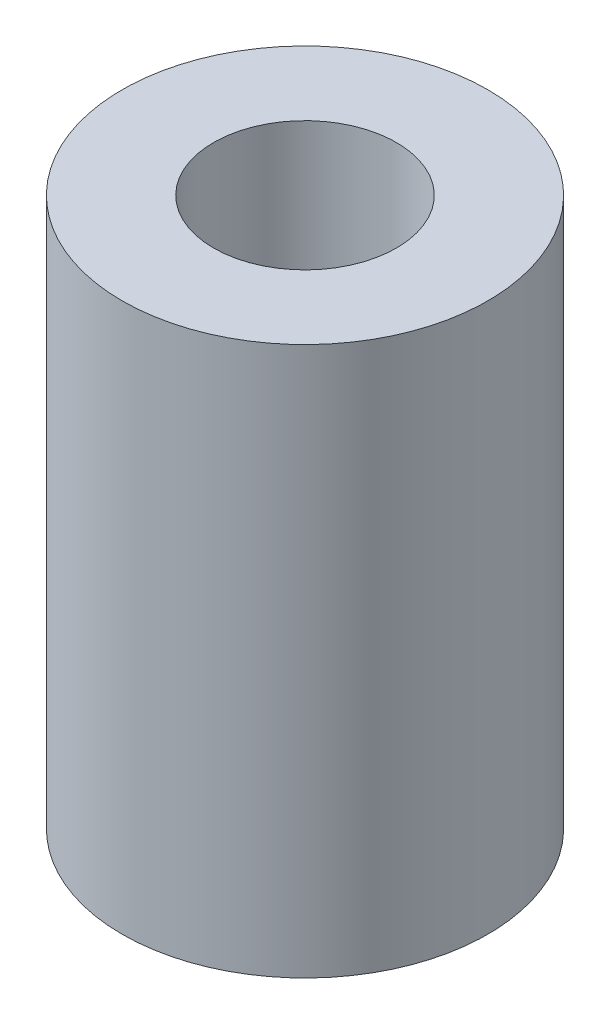
ISO-10303-21;
HEADER;
FILE_DESCRIPTION(('STEP AP214'),'2;1');
FILE_NAME('part.step','',(''),(''),'','','');
FILE_SCHEMA(('AUTOMOTIVE_DESIGN { 1 0 10303 214 1 1 1 1 }'));
ENDSEC;
DATA;
#1=APPLICATION_CONTEXT('core data for automotive mechanical design processes');
#2=APPLICATION_PROTOCOL_DEFINITION('international standard','automotive_design',2000,#1);
#3=PRODUCT_CONTEXT('',#1,'mechanical');
#4=PRODUCT('Part','Part','',(#3));
#5=PRODUCT_RELATED_PRODUCT_CATEGORY('part','',(#4));
#6=PRODUCT_DEFINITION_FORMATION('','',#4);
#7=PRODUCT_DEFINITION_CONTEXT('part definition',#1,'design');
#8=PRODUCT_DEFINITION('design','',#6,#7);
#9=PRODUCT_DEFINITION_SHAPE('','',#8);
#10=(LENGTH_UNIT() NAMED_UNIT(*) SI_UNIT(.MILLI.,.METRE.));
#11=(NAMED_UNIT(*) PLANE_ANGLE_UNIT() SI_UNIT($,.RADIAN.));
#12=(NAMED_UNIT(*) SI_UNIT($,.STERADIAN.) SOLID_ANGLE_UNIT());
#13=UNCERTAINTY_MEASURE_WITH_UNIT(LENGTH_MEASURE(1.E-05),#10,'distance_accuracy_value','');
#14=(GEOMETRIC_REPRESENTATION_CONTEXT(3) GLOBAL_UNCERTAINTY_ASSIGNED_CONTEXT((#13)) GLOBAL_UNIT_ASSIGNED_CONTEXT((#10,
#11,#12)) REPRESENTATION_CONTEXT('',''));
#15=CARTESIAN_POINT('',(0.,0.,0.));
#16=DIRECTION('',(0.,0.,1.));
#17=DIRECTION('',(1.,0.,0.));
#18=AXIS2_PLACEMENT_3D('',#15,#16,#17);
#19=CARTESIAN_POINT('',(0.,19.05,0.));
#20=DIRECTION('',(0.,-1.,0.));
#21=DIRECTION('',(0.,0.,-1.));
#22=AXIS2_PLACEMENT_3D('',#19,#20,#21);
#23=CYLINDRICAL_SURFACE('',#22,6.35);
#24=CARTESIAN_POINT('',(0.,19.05,0.));
#25=DIRECTION('',(0.,1.,0.));
#26=DIRECTION('',(0.,0.,1.));
#27=AXIS2_PLACEMENT_3D('',#24,#25,#26);
#28=CIRCLE('',#27,6.35);
#29=CARTESIAN_POINT('',(0.,19.05,-6.35));
#30=VERTEX_POINT('',#29);
#31=EDGE_CURVE('E10',#30,#30,#28,.T.);
#32=CARTESIAN_POINT('',(0.,0.,0.));
#33=DIRECTION('',(0.,1.,0.));
#34=DIRECTION('',(0.,0.,1.));
#35=AXIS2_PLACEMENT_3D('',#32,#33,#34);
#36=CIRCLE('',#35,6.35);
#37=CARTESIAN_POINT('',(0.,0.,-6.35));
#38=VERTEX_POINT('',#37);
#39=EDGE_CURVE('E35',#38,#38,#36,.T.);
#40=CARTESIAN_POINT('',(0.,19.05,-6.35));
#41=CARTESIAN_POINT('',(0.,18.8515625,-6.35));
#42=CARTESIAN_POINT('',(0.,18.653125,-6.35));
#43=CARTESIAN_POINT('',(0.,18.25625,-6.35));
#44=CARTESIAN_POINT('',(0.,18.0578125,-6.35));
#45=CARTESIAN_POINT('',(0.,17.6609375,-6.35));
#46=CARTESIAN_POINT('',(0.,17.4625,-6.35));
#47=CARTESIAN_POINT('',(0.,17.065625,-6.35));
#48=CARTESIAN_POINT('',(0.,16.8671875,-6.35));
#49=CARTESIAN_POINT('',(0.,16.4703125,-6.35));
#50=CARTESIAN_POINT('',(0.,16.271875,-6.35));
#51=CARTESIAN_POINT('',(0.,15.875,-6.35));
#52=CARTESIAN_POINT('',(0.,15.6765625,-6.35));
#53=CARTESIAN_POINT('',(0.,15.2796875,-6.35));
#54=CARTESIAN_POINT('',(0.,15.08125,-6.35));
#55=CARTESIAN_POINT('',(0.,14.684375,-6.35));
#56=CARTESIAN_POINT('',(0.,14.4859375,-6.35));
#57=CARTESIAN_POINT('',(0.,14.0890625,-6.35));
#58=CARTESIAN_POINT('',(0.,13.890625,-6.35));
#59=CARTESIAN_POINT('',(0.,13.49375,-6.35));
#60=CARTESIAN_POINT('',(0.,13.2953125,-6.35));
#61=CARTESIAN_POINT('',(0.,12.8984375,-6.35));
#62=CARTESIAN_POINT('',(0.,12.7,-6.35));
#63=CARTESIAN_POINT('',(0.,12.303125,-6.35));
#64=CARTESIAN_POINT('',(0.,12.1046875,-6.35));
#65=CARTESIAN_POINT('',(0.,11.7078125,-6.35));
#66=CARTESIAN_POINT('',(0.,11.509375,-6.35));
#67=CARTESIAN_POINT('',(0.,11.1125,-6.35));
#68=CARTESIAN_POINT('',(0.,10.9140625,-6.35));
#69=CARTESIAN_POINT('',(0.,10.5171875,-6.35));
#70=CARTESIAN_POINT('',(0.,10.31875,-6.35));
#71=CARTESIAN_POINT('',(0.,9.921875,-6.35));
#72=CARTESIAN_POINT('',(0.,9.7234375,-6.35));
#73=CARTESIAN_POINT('',(0.,9.3265625,-6.35));
#74=CARTESIAN_POINT('',(0.,9.128125,-6.35));
#75=CARTESIAN_POINT('',(0.,8.73125,-6.35));
#76=CARTESIAN_POINT('',(0.,8.5328125,-6.35));
#77=CARTESIAN_POINT('',(0.,8.1359375,-6.35));
#78=CARTESIAN_POINT('',(0.,7.9375,-6.35));
#79=CARTESIAN_POINT('',(0.,7.540625,-6.35));
#80=CARTESIAN_POINT('',(0.,7.3421875,-6.35));
#81=CARTESIAN_POINT('',(0.,6.9453125,-6.35));
#82=CARTESIAN_POINT('',(0.,6.746875,-6.35));
#83=CARTESIAN_POINT('',(0.,6.35,-6.35));
#84=CARTESIAN_POINT('',(0.,6.1515625,-6.35));
#85=CARTESIAN_POINT('',(0.,5.7546875,-6.35));
#86=CARTESIAN_POINT('',(0.,5.55625,-6.35));
#87=CARTESIAN_POINT('',(0.,5.159375,-6.35));
#88=CARTESIAN_POINT('',(0.,4.9609375,-6.35));
#89=CARTESIAN_POINT('',(0.,4.5640625,-6.35));
#90=CARTESIAN_POINT('',(0.,4.365625,-6.35));
#91=CARTESIAN_POINT('',(0.,3.96875,-6.35));
#92=CARTESIAN_POINT('',(0.,3.7703125,-6.35));
#93=CARTESIAN_POINT('',(0.,3.3734375,-6.35));
#94=CARTESIAN_POINT('',(0.,3.175,-6.35));
#95=CARTESIAN_POINT('',(0.,2.778125,-6.35));
#96=CARTESIAN_POINT('',(0.,2.5796875,-6.35));
#97=CARTESIAN_POINT('',(0.,2.1828125,-6.35));
#98=CARTESIAN_POINT('',(0.,1.984375,-6.35));
#99=CARTESIAN_POINT('',(0.,1.5875,-6.35));
#100=CARTESIAN_POINT('',(0.,1.3890625,-6.35));
#101=CARTESIAN_POINT('',(0.,0.992187500000001,-6.35));
#102=CARTESIAN_POINT('',(0.,0.793750000000001,-6.35));
#103=CARTESIAN_POINT('',(0.,0.396875,-6.35));
#104=CARTESIAN_POINT('',(0.,0.1984375,-6.35));
#105=CARTESIAN_POINT('',(0.,0.,-6.35));
#106=B_SPLINE_CURVE_WITH_KNOTS('',3,(#40,#41,#42,#43,#44,#45,#46,#47,#48,#49,#50,#51,#52,#53,
#54,#55,#56,#57,#58,#59,#60,#61,#62,#63,#64,#65,#66,#67,#68,#69,#70,#71,#72,#73,#74,#75,#76,#77,
#78,#79,#80,#81,#82,#83,#84,#85,#86,#87,#88,#89,#90,#91,#92,#93,#94,#95,#96,#97,#98,#99,#100,
#101,#102,#103,#104,#105),.UNSPECIFIED.,.F.,.F.,(4,2,2,2,2,2,2,2,2,2,2,2,2,2,2,2,2,2,2,2,2,2,2,
2,2,2,2,2,2,2,2,2,4),(0.,0.5953125,1.190625,1.7859375,2.38125,2.9765625,3.571875,4.1671875,
4.7625,5.3578125,5.953125,6.5484375,7.14375,7.7390625,8.334375,8.9296875,9.525,10.1203125,
10.715625,11.3109375,11.90625,12.5015625,13.096875,13.6921875,14.2875,14.8828125,15.478125,
16.0734375,16.66875,17.2640625,17.859375,18.4546875,19.05),.UNSPECIFIED.);
#107=EDGE_CURVE('BSEAM32',#30,#38,#106,.T.);
#108=ORIENTED_EDGE('',*,*,#31,.F.);
#109=ORIENTED_EDGE('',*,*,#39,.T.);
#110=ORIENTED_EDGE('',*,*,#107,.T.);
#111=ORIENTED_EDGE('',*,*,#107,.F.);
#112=EDGE_LOOP('',(#108,#110,#109,#111));
#113=FACE_BOUND('',#112,.T.);
#114=ADVANCED_FACE('F32',(#113),#23,.T.);
#115=CARTESIAN_POINT('',(0.,19.05,0.));
#116=DIRECTION('',(0.,1.,0.));
#117=DIRECTION('',(0.,0.,1.));
#118=AXIS2_PLACEMENT_3D('',#115,#116,#117);
#119=PLANE('',#118);
#120=CARTESIAN_POINT('',(0.,19.05,0.));
#121=DIRECTION('',(0.,1.,0.));
#122=DIRECTION('',(0.,0.,1.));
#123=AXIS2_PLACEMENT_3D('',#120,#121,#122);
#124=CIRCLE('',#123,3.175);
#125=CARTESIAN_POINT('',(0.,19.05,3.175));
#126=VERTEX_POINT('',#125);
#127=EDGE_CURVE('E42',#126,#126,#124,.T.);
#128=ORIENTED_EDGE('',*,*,#127,.F.);
#129=EDGE_LOOP('',(#128));
#130=FACE_BOUND('',#129,.T.);
#131=ORIENTED_EDGE('',*,*,#31,.T.);
#132=EDGE_LOOP('',(#131));
#133=FACE_BOUND('',#132,.T.);
#134=ADVANCED_FACE('F60',(#130,#133),#119,.T.);
#135=CARTESIAN_POINT('',(0.,0.,0.));
#136=DIRECTION('',(0.,1.,0.));
#137=DIRECTION('',(0.,0.,1.));
#138=AXIS2_PLACEMENT_3D('',#135,#136,#137);
#139=PLANE('',#138);
#140=CARTESIAN_POINT('',(0.,0.,0.));
#141=DIRECTION('',(0.,1.,0.));
#142=DIRECTION('',(0.,0.,1.));
#143=AXIS2_PLACEMENT_3D('',#140,#141,#142);
#144=CIRCLE('',#143,3.175);
#145=CARTESIAN_POINT('',(0.,0.,3.175));
#146=VERTEX_POINT('',#145);
#147=EDGE_CURVE('E46',#146,#146,#144,.T.);
#148=ORIENTED_EDGE('',*,*,#147,.T.);
#149=EDGE_LOOP('',(#148));
#150=FACE_BOUND('',#149,.T.);
#151=ORIENTED_EDGE('',*,*,#39,.F.);
#152=EDGE_LOOP('',(#151));
#153=FACE_BOUND('',#152,.T.);
#154=ADVANCED_FACE('F50',(#150,#153),#139,.F.);
#155=CARTESIAN_POINT('',(0.,0.,0.));
#156=DIRECTION('',(0.,1.,0.));
#157=DIRECTION('',(0.,0.,1.));
#158=AXIS2_PLACEMENT_3D('',#155,#156,#157);
#159=CYLINDRICAL_SURFACE('',#158,3.175);
#160=CARTESIAN_POINT('',(0.,19.05,3.175));
#161=CARTESIAN_POINT('',(0.,18.8515625,3.175));
#162=CARTESIAN_POINT('',(0.,18.653125,3.175));
#163=CARTESIAN_POINT('',(0.,18.25625,3.175));
#164=CARTESIAN_POINT('',(0.,18.0578125,3.175));
#165=CARTESIAN_POINT('',(0.,17.6609375,3.175));
#166=CARTESIAN_POINT('',(0.,17.4625,3.175));
#167=CARTESIAN_POINT('',(0.,17.065625,3.175));
#168=CARTESIAN_POINT('',(0.,16.8671875,3.175));
#169=CARTESIAN_POINT('',(0.,16.4703125,3.175));
#170=CARTESIAN_POINT('',(0.,16.271875,3.175));
#171=CARTESIAN_POINT('',(0.,15.875,3.175));
#172=CARTESIAN_POINT('',(0.,15.6765625,3.175));
#173=CARTESIAN_POINT('',(0.,15.2796875,3.175));
#174=CARTESIAN_POINT('',(0.,15.08125,3.175));
#175=CARTESIAN_POINT('',(0.,14.684375,3.175));
#176=CARTESIAN_POINT('',(0.,14.4859375,3.175));
#177=CARTESIAN_POINT('',(0.,14.0890625,3.175));
#178=CARTESIAN_POINT('',(0.,13.890625,3.175));
#179=CARTESIAN_POINT('',(0.,13.49375,3.175));
#180=CARTESIAN_POINT('',(0.,13.2953125,3.175));
#181=CARTESIAN_POINT('',(0.,12.8984375,3.175));
#182=CARTESIAN_POINT('',(0.,12.7,3.175));
#183=CARTESIAN_POINT('',(0.,12.303125,3.175));
#184=CARTESIAN_POINT('',(0.,12.1046875,3.175));
#185=CARTESIAN_POINT('',(0.,11.7078125,3.175));
#186=CARTESIAN_POINT('',(0.,11.509375,3.175));
#187=CARTESIAN_POINT('',(0.,11.1125,3.175));
#188=CARTESIAN_POINT('',(0.,10.9140625,3.175));
#189=CARTESIAN_POINT('',(0.,10.5171875,3.175));
#190=CARTESIAN_POINT('',(0.,10.31875,3.175));
#191=CARTESIAN_POINT('',(0.,9.921875,3.175));
#192=CARTESIAN_POINT('',(0.,9.7234375,3.175));
#193=CARTESIAN_POINT('',(0.,9.3265625,3.175));
#194=CARTESIAN_POINT('',(0.,9.128125,3.175));
#195=CARTESIAN_POINT('',(0.,8.73125,3.175));
#196=CARTESIAN_POINT('',(0.,8.5328125,3.175));
#197=CARTESIAN_POINT('',(0.,8.1359375,3.175));
#198=CARTESIAN_POINT('',(0.,7.9375,3.175));
#199=CARTESIAN_POINT('',(0.,7.540625,3.175));
#200=CARTESIAN_POINT('',(0.,7.3421875,3.175));
#201=CARTESIAN_POINT('',(0.,6.9453125,3.175));
#202=CARTESIAN_POINT('',(0.,6.746875,3.175));
#203=CARTESIAN_POINT('',(0.,6.35,3.175));
#204=CARTESIAN_POINT('',(0.,6.1515625,3.175));
#205=CARTESIAN_POINT('',(0.,5.7546875,3.175));
#206=CARTESIAN_POINT('',(0.,5.55625,3.175));
#207=CARTESIAN_POINT('',(0.,5.159375,3.175));
#208=CARTESIAN_POINT('',(0.,4.9609375,3.175));
#209=CARTESIAN_POINT('',(0.,4.5640625,3.175));
#210=CARTESIAN_POINT('',(0.,4.365625,3.175));
#211=CARTESIAN_POINT('',(0.,3.96875,3.175));
#212=CARTESIAN_POINT('',(0.,3.7703125,3.175));
#213=CARTESIAN_POINT('',(0.,3.3734375,3.175));
#214=CARTESIAN_POINT('',(0.,3.175,3.175));
#215=CARTESIAN_POINT('',(0.,2.778125,3.175));
#216=CARTESIAN_POINT('',(0.,2.5796875,3.175));
#217=CARTESIAN_POINT('',(0.,2.1828125,3.175));
#218=CARTESIAN_POINT('',(0.,1.984375,3.175));
#219=CARTESIAN_POINT('',(0.,1.5875,3.175));
#220=CARTESIAN_POINT('',(0.,1.3890625,3.175));
#221=CARTESIAN_POINT('',(0.,0.9921875,3.175));
#222=CARTESIAN_POINT('',(0.,0.79375,3.175));
#223=CARTESIAN_POINT('',(0.,0.396875,3.175));
#224=CARTESIAN_POINT('',(0.,0.1984375,3.175));
#225=CARTESIAN_POINT('',(0.,0.,3.175));
#226=B_SPLINE_CURVE_WITH_KNOTS('',3,(#160,#161,#162,#163,#164,#165,#166,#167,#168,#169,#170,
#171,#172,#173,#174,#175,#176,#177,#178,#179,#180,#181,#182,#183,#184,#185,#186,#187,#188,#189,
#190,#191,#192,#193,#194,#195,#196,#197,#198,#199,#200,#201,#202,#203,#204,#205,#206,#207,#208,
#209,#210,#211,#212,#213,#214,#215,#216,#217,#218,#219,#220,#221,#222,#223,#224,#225),
.UNSPECIFIED.,.F.,.F.,(4,2,2,2,2,2,2,2,2,2,2,2,2,2,2,2,2,2,2,2,2,2,2,2,2,2,2,2,2,2,2,2,4),(0.,
0.5953125,1.190625,1.7859375,2.38125,2.9765625,3.571875,4.1671875,4.7625,5.3578125,5.953125,
6.5484375,7.14375,7.7390625,8.334375,8.9296875,9.525,10.1203125,10.715625,11.3109375,11.90625,
12.5015625,13.096875,13.6921875,14.2875,14.8828125,15.478125,16.0734375,16.66875,17.2640625,
17.859375,18.4546875,19.05),.UNSPECIFIED.);
#227=EDGE_CURVE('BSEAM53',#126,#146,#226,.T.);
#228=ORIENTED_EDGE('',*,*,#127,.T.);
#229=ORIENTED_EDGE('',*,*,#147,.F.);
#230=ORIENTED_EDGE('',*,*,#227,.T.);
#231=ORIENTED_EDGE('',*,*,#227,.F.);
#232=EDGE_LOOP('',(#228,#230,#229,#231));
#233=FACE_BOUND('',#232,.T.);
#234=ADVANCED_FACE('F53',(#233),#159,.F.);
#235=CLOSED_SHELL('',(#114,#134,#154,#234));
#236=MANIFOLD_SOLID_BREP('B2',#235);
#237=ADVANCED_BREP_SHAPE_REPRESENTATION('',(#18,#236),#14);
#238=SHAPE_DEFINITION_REPRESENTATION(#9,#237);
ENDSEC;
END-ISO-10303-21;
